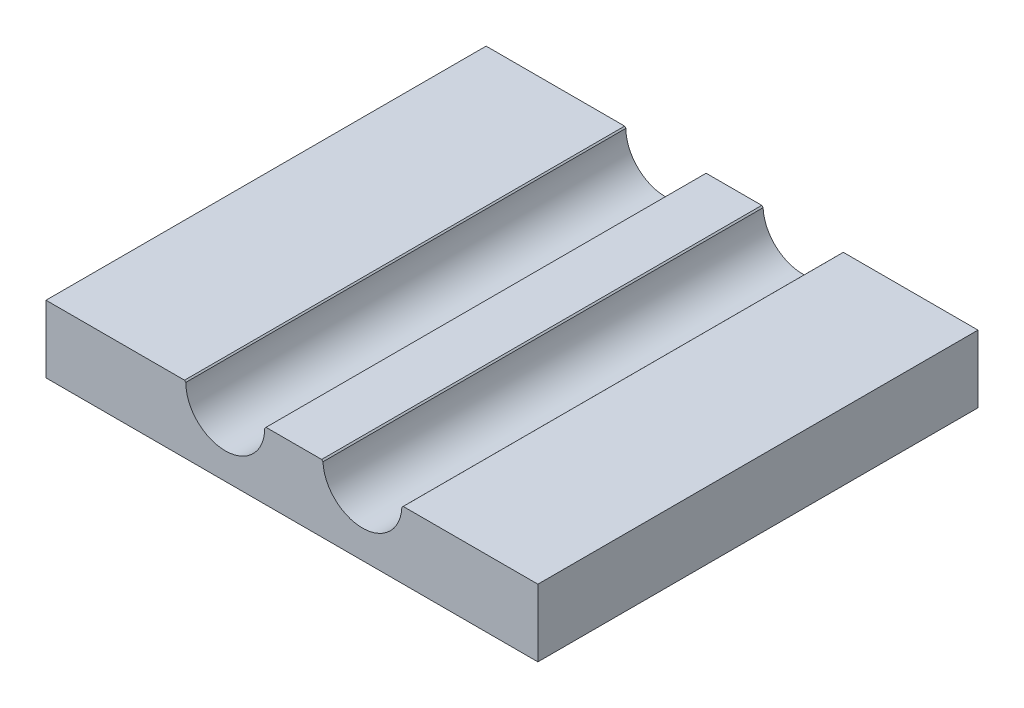
ISO-10303-21;
HEADER;
FILE_DESCRIPTION(('STEP AP214'),'2;1');
FILE_NAME('part.step','',(''),(''),'','','');
FILE_SCHEMA(('AUTOMOTIVE_DESIGN { 1 0 10303 214 1 1 1 1 }'));
ENDSEC;
DATA;
#1=APPLICATION_CONTEXT('core data for automotive mechanical design processes');
#2=APPLICATION_PROTOCOL_DEFINITION('international standard','automotive_design',2000,#1);
#3=PRODUCT_CONTEXT('',#1,'mechanical');
#4=PRODUCT('Part','Part','',(#3));
#5=PRODUCT_RELATED_PRODUCT_CATEGORY('part','',(#4));
#6=PRODUCT_DEFINITION_FORMATION('','',#4);
#7=PRODUCT_DEFINITION_CONTEXT('part definition',#1,'design');
#8=PRODUCT_DEFINITION('design','',#6,#7);
#9=PRODUCT_DEFINITION_SHAPE('','',#8);
#10=(LENGTH_UNIT() NAMED_UNIT(*) SI_UNIT(.MILLI.,.METRE.));
#11=(NAMED_UNIT(*) PLANE_ANGLE_UNIT() SI_UNIT($,.RADIAN.));
#12=(NAMED_UNIT(*) SI_UNIT($,.STERADIAN.) SOLID_ANGLE_UNIT());
#13=UNCERTAINTY_MEASURE_WITH_UNIT(LENGTH_MEASURE(1.E-05),#10,'distance_accuracy_value','');
#14=(GEOMETRIC_REPRESENTATION_CONTEXT(3) GLOBAL_UNCERTAINTY_ASSIGNED_CONTEXT((#13)) GLOBAL_UNIT_ASSIGNED_CONTEXT((#10,
#11,#12)) REPRESENTATION_CONTEXT('',''));
#15=CARTESIAN_POINT('',(0.,0.,0.));
#16=DIRECTION('',(0.,0.,1.));
#17=DIRECTION('',(1.,0.,0.));
#18=AXIS2_PLACEMENT_3D('',#15,#16,#17);
#19=CARTESIAN_POINT('',(-19.,2.,-17.));
#20=DIRECTION('',(1.,0.,0.));
#21=DIRECTION('',(0.,0.,-1.));
#22=AXIS2_PLACEMENT_3D('',#19,#20,#21);
#23=PLANE('',#22);
#24=DIRECTION('',(0.,0.,1.));
#25=VECTOR('',#24,1.);
#26=CARTESIAN_POINT('',(-19.,0.,-17.));
#27=LINE('',#26,#25);
#28=CARTESIAN_POINT('',(-19.,0.,-17.));
#29=VERTEX_POINT('',#28);
#30=CARTESIAN_POINT('',(-19.,0.,17.));
#31=VERTEX_POINT('',#30);
#32=EDGE_CURVE('E152',#29,#31,#27,.T.);
#33=ORIENTED_EDGE('',*,*,#32,.T.);
#34=DIRECTION('',(0.,-1.,0.));
#35=VECTOR('',#34,1.);
#36=CARTESIAN_POINT('',(-19.,2.,17.));
#37=LINE('',#36,#35);
#38=CARTESIAN_POINT('',(-19.,5.19853740308985,17.));
#39=VERTEX_POINT('',#38);
#40=EDGE_CURVE('E148',#39,#31,#37,.T.);
#41=ORIENTED_EDGE('',*,*,#40,.F.);
#42=DIRECTION('',(0.,0.,1.));
#43=VECTOR('',#42,1.);
#44=CARTESIAN_POINT('',(-19.,5.19853740308985,-17.));
#45=LINE('',#44,#43);
#46=CARTESIAN_POINT('',(-19.,5.19853740308985,-17.));
#47=VERTEX_POINT('',#46);
#48=EDGE_CURVE('E129',#47,#39,#45,.T.);
#49=ORIENTED_EDGE('',*,*,#48,.F.);
#50=DIRECTION('',(0.,-1.,0.));
#51=VECTOR('',#50,1.);
#52=CARTESIAN_POINT('',(-19.,2.,-17.));
#53=LINE('',#52,#51);
#54=EDGE_CURVE('E137',#47,#29,#53,.T.);
#55=ORIENTED_EDGE('',*,*,#54,.T.);
#56=EDGE_LOOP('',(#33,#41,#49,#55));
#57=FACE_BOUND('',#56,.T.);
#58=ADVANCED_FACE('F34',(#57),#23,.F.);
#59=CARTESIAN_POINT('',(-19.,2.,17.));
#60=DIRECTION('',(0.,0.,-1.));
#61=DIRECTION('',(-1.,0.,0.));
#62=AXIS2_PLACEMENT_3D('',#59,#60,#61);
#63=PLANE('',#62);
#64=DIRECTION('',(-1.,0.,0.));
#65=VECTOR('',#64,1.);
#66=CARTESIAN_POINT('',(19.,5.19950437404045,17.));
#67=LINE('',#66,#65);
#68=CARTESIAN_POINT('',(19.,5.19950437404045,17.));
#69=VERTEX_POINT('',#68);
#70=CARTESIAN_POINT('',(8.59514601795926,5.19950437404045,17.));
#71=VERTEX_POINT('',#70);
#72=EDGE_CURVE('E214',#69,#71,#67,.T.);
#73=ORIENTED_EDGE('',*,*,#72,.T.);
#74=DIRECTION('',(0.713628649764798,0.700524196751883,0.));
#75=VECTOR('',#74,1.);
#76=CARTESIAN_POINT('',(8.59514601795926,5.19950437404045,17.));
#77=LINE('',#76,#75);
#78=CARTESIAN_POINT('',(8.49156819575268,5.09782856446289,17.));
#79=VERTEX_POINT('',#78);
#80=EDGE_CURVE('E179',#71,#79,#77,.F.);
#81=ORIENTED_EDGE('',*,*,#80,.T.);
#82=CARTESIAN_POINT('',(5.44433729683627,5.22776642918728,17.));
#83=DIRECTION('',(0.,0.,-1.));
#84=DIRECTION('',(1.,0.,0.));
#85=AXIS2_PLACEMENT_3D('',#82,#83,#84);
#86=CIRCLE('',#85,3.05);
#87=CARTESIAN_POINT('',(2.39747173200565,5.08952667423475,17.));
#88=VERTEX_POINT('',#87);
#89=EDGE_CURVE('E216',#79,#88,#86,.T.);
#90=ORIENTED_EDGE('',*,*,#89,.T.);
#91=DIRECTION('',(0.70710678118654,-0.707106781186555,0.));
#92=VECTOR('',#91,1.);
#93=CARTESIAN_POINT('',(2.39747173200564,5.08952667423475,17.));
#94=LINE('',#93,#92);
#95=CARTESIAN_POINT('',(2.29454169320224,5.19245671303816,17.));
#96=VERTEX_POINT('',#95);
#97=EDGE_CURVE('E173',#88,#96,#94,.F.);
#98=ORIENTED_EDGE('',*,*,#97,.T.);
#99=DIRECTION('',(-1.,0.,0.));
#100=VECTOR('',#99,1.);
#101=CARTESIAN_POINT('',(-2.10116958482422,5.19245671303816,17.));
#102=LINE('',#101,#100);
#103=CARTESIAN_POINT('',(-2.00417351717299,5.19245671303816,17.));
#104=VERTEX_POINT('',#103);
#105=EDGE_CURVE('E212',#96,#104,#102,.T.);
#106=ORIENTED_EDGE('',*,*,#105,.T.);
#107=DIRECTION('',(0.684507714180994,0.729005616731936,0.));
#108=VECTOR('',#107,1.);
#109=CARTESIAN_POINT('',(-2.00417351717299,5.19245671303816,17.));
#110=LINE('',#109,#108);
#111=CARTESIAN_POINT('',(-2.09966479765156,5.09075781560339,17.));
#112=VERTEX_POINT('',#111);
#113=EDGE_CURVE('E175',#104,#112,#110,.F.);
#114=ORIENTED_EDGE('',*,*,#113,.T.);
#115=CARTESIAN_POINT('',(-5.14965941266187,5.09648916867897,17.));
#116=DIRECTION('',(0.,0.,-1.));
#117=DIRECTION('',(1.,0.,0.));
#118=AXIS2_PLACEMENT_3D('',#115,#116,#117);
#119=CIRCLE('',#118,3.05);
#120=CARTESIAN_POINT('',(-8.19965710291714,5.1002427586348,17.));
#121=VERTEX_POINT('',#120);
#122=EDGE_CURVE('E204',#112,#121,#119,.T.);
#123=ORIENTED_EDGE('',*,*,#122,.T.);
#124=DIRECTION('',(0.707106781186544,-0.707106781186551,0.));
#125=VECTOR('',#124,1.);
#126=CARTESIAN_POINT('',(-8.19965710291714,5.1002427586348,17.));
#127=LINE('',#126,#125);
#128=CARTESIAN_POINT('',(-8.29795174737219,5.19853740308985,17.));
#129=VERTEX_POINT('',#128);
#130=EDGE_CURVE('E177',#121,#129,#127,.F.);
#131=ORIENTED_EDGE('',*,*,#130,.T.);
#132=DIRECTION('',(-1.,0.,0.));
#133=VECTOR('',#132,1.);
#134=CARTESIAN_POINT('',(-8.19795174737218,5.19853740308985,17.));
#135=LINE('',#134,#133);
#136=EDGE_CURVE('E211',#129,#39,#135,.T.);
#137=ORIENTED_EDGE('',*,*,#136,.T.);
#138=ORIENTED_EDGE('',*,*,#40,.T.);
#139=DIRECTION('',(1.,0.,0.));
#140=VECTOR('',#139,1.);
#141=CARTESIAN_POINT('',(-19.,0.,17.));
#142=LINE('',#141,#140);
#143=CARTESIAN_POINT('',(19.,0.,17.));
#144=VERTEX_POINT('',#143);
#145=EDGE_CURVE('E159',#31,#144,#142,.T.);
#146=ORIENTED_EDGE('',*,*,#145,.T.);
#147=DIRECTION('',(0.,-1.,0.));
#148=VECTOR('',#147,1.);
#149=CARTESIAN_POINT('',(19.,2.,17.));
#150=LINE('',#149,#148);
#151=EDGE_CURVE('E167',#69,#144,#150,.T.);
#152=ORIENTED_EDGE('',*,*,#151,.F.);
#153=EDGE_LOOP('',(#73,#81,#90,#98,#106,#114,#123,#131,#137,#138,#146,#152));
#154=FACE_BOUND('',#153,.T.);
#155=ADVANCED_FACE('F209',(#154),#63,.F.);
#156=CARTESIAN_POINT('',(19.,2.,-17.));
#157=DIRECTION('',(-1.,0.,0.));
#158=DIRECTION('',(0.,0.,1.));
#159=AXIS2_PLACEMENT_3D('',#156,#157,#158);
#160=PLANE('',#159);
#161=DIRECTION('',(0.,0.,-1.));
#162=VECTOR('',#161,1.);
#163=CARTESIAN_POINT('',(19.,0.,-17.));
#164=LINE('',#163,#162);
#165=CARTESIAN_POINT('',(19.,0.,-17.));
#166=VERTEX_POINT('',#165);
#167=EDGE_CURVE('E162',#144,#166,#164,.T.);
#168=ORIENTED_EDGE('',*,*,#167,.T.);
#169=DIRECTION('',(0.,-1.,0.));
#170=VECTOR('',#169,1.);
#171=CARTESIAN_POINT('',(19.,2.,-17.));
#172=LINE('',#171,#170);
#173=CARTESIAN_POINT('',(19.,5.19950437404045,-17.));
#174=VERTEX_POINT('',#173);
#175=EDGE_CURVE('E145',#174,#166,#172,.T.);
#176=ORIENTED_EDGE('',*,*,#175,.F.);
#177=DIRECTION('',(0.,0.,1.));
#178=VECTOR('',#177,1.);
#179=CARTESIAN_POINT('',(19.,5.19950437404045,-17.));
#180=LINE('',#179,#178);
#181=EDGE_CURVE('E149',#174,#69,#180,.T.);
#182=ORIENTED_EDGE('',*,*,#181,.T.);
#183=ORIENTED_EDGE('',*,*,#151,.T.);
#184=EDGE_LOOP('',(#168,#176,#182,#183));
#185=FACE_BOUND('',#184,.T.);
#186=ADVANCED_FACE('F241',(#185),#160,.F.);
#187=CARTESIAN_POINT('',(-19.,2.,-17.));
#188=DIRECTION('',(0.,0.,1.));
#189=DIRECTION('',(1.,0.,0.));
#190=AXIS2_PLACEMENT_3D('',#187,#188,#189);
#191=PLANE('',#190);
#192=CARTESIAN_POINT('',(5.44433729683627,5.22776642918728,-17.));
#193=DIRECTION('',(0.,0.,-1.));
#194=DIRECTION('',(1.,0.,0.));
#195=AXIS2_PLACEMENT_3D('',#192,#193,#194);
#196=CIRCLE('',#195,3.05);
#197=CARTESIAN_POINT('',(8.49156819575267,5.09782856446289,-17.));
#198=VERTEX_POINT('',#197);
#199=CARTESIAN_POINT('',(2.39747173200565,5.08952667423475,-17.));
#200=VERTEX_POINT('',#199);
#201=EDGE_CURVE('E219',#198,#200,#196,.T.);
#202=ORIENTED_EDGE('',*,*,#201,.F.);
#203=DIRECTION('',(-0.713628649764798,-0.700524196751883,0.));
#204=VECTOR('',#203,1.);
#205=CARTESIAN_POINT('',(8.59514601795926,5.19950437404045,-17.));
#206=LINE('',#205,#204);
#207=CARTESIAN_POINT('',(8.59514601795926,5.19950437404045,-17.));
#208=VERTEX_POINT('',#207);
#209=EDGE_CURVE('E191',#198,#208,#206,.F.);
#210=ORIENTED_EDGE('',*,*,#209,.T.);
#211=DIRECTION('',(-1.,0.,0.));
#212=VECTOR('',#211,1.);
#213=CARTESIAN_POINT('',(19.,5.19950437404045,-17.));
#214=LINE('',#213,#212);
#215=EDGE_CURVE('E133',#174,#208,#214,.T.);
#216=ORIENTED_EDGE('',*,*,#215,.F.);
#217=ORIENTED_EDGE('',*,*,#175,.T.);
#218=DIRECTION('',(-1.,0.,0.));
#219=VECTOR('',#218,1.);
#220=CARTESIAN_POINT('',(-19.,0.,-17.));
#221=LINE('',#220,#219);
#222=EDGE_CURVE('E141',#166,#29,#221,.T.);
#223=ORIENTED_EDGE('',*,*,#222,.T.);
#224=ORIENTED_EDGE('',*,*,#54,.F.);
#225=DIRECTION('',(-1.,0.,0.));
#226=VECTOR('',#225,1.);
#227=CARTESIAN_POINT('',(-8.19795174737218,5.19853740308985,-17.));
#228=LINE('',#227,#226);
#229=CARTESIAN_POINT('',(-8.29795174737219,5.19853740308985,-17.));
#230=VERTEX_POINT('',#229);
#231=EDGE_CURVE('E124',#230,#47,#228,.T.);
#232=ORIENTED_EDGE('',*,*,#231,.F.);
#233=DIRECTION('',(-0.707106781186544,0.707106781186551,0.));
#234=VECTOR('',#233,1.);
#235=CARTESIAN_POINT('',(-8.19965710291714,5.1002427586348,-17.));
#236=LINE('',#235,#234);
#237=CARTESIAN_POINT('',(-8.19965710291714,5.1002427586348,-17.));
#238=VERTEX_POINT('',#237);
#239=EDGE_CURVE('E189',#230,#238,#236,.F.);
#240=ORIENTED_EDGE('',*,*,#239,.T.);
#241=CARTESIAN_POINT('',(-5.14965941266187,5.09648916867897,-17.));
#242=DIRECTION('',(0.,0.,-1.));
#243=DIRECTION('',(1.,0.,0.));
#244=AXIS2_PLACEMENT_3D('',#241,#242,#243);
#245=CIRCLE('',#244,3.05);
#246=CARTESIAN_POINT('',(-2.09966479765156,5.09075781560339,-17.));
#247=VERTEX_POINT('',#246);
#248=EDGE_CURVE('E134',#247,#238,#245,.T.);
#249=ORIENTED_EDGE('',*,*,#248,.F.);
#250=DIRECTION('',(-0.684507714180994,-0.729005616731936,0.));
#251=VECTOR('',#250,1.);
#252=CARTESIAN_POINT('',(-2.00417351717299,5.19245671303816,-17.));
#253=LINE('',#252,#251);
#254=CARTESIAN_POINT('',(-2.00417351717299,5.19245671303816,-17.));
#255=VERTEX_POINT('',#254);
#256=EDGE_CURVE('E49',#247,#255,#253,.F.);
#257=ORIENTED_EDGE('',*,*,#256,.T.);
#258=DIRECTION('',(-1.,0.,0.));
#259=VECTOR('',#258,1.);
#260=CARTESIAN_POINT('',(-2.10116958482422,5.19245671303816,-17.));
#261=LINE('',#260,#259);
#262=CARTESIAN_POINT('',(2.29454169320224,5.19245671303816,-17.));
#263=VERTEX_POINT('',#262);
#264=EDGE_CURVE('E222',#263,#255,#261,.T.);
#265=ORIENTED_EDGE('',*,*,#264,.F.);
#266=DIRECTION('',(-0.70710678118654,0.707106781186555,0.));
#267=VECTOR('',#266,1.);
#268=CARTESIAN_POINT('',(2.39747173200564,5.08952667423475,-17.));
#269=LINE('',#268,#267);
#270=EDGE_CURVE('E186',#263,#200,#269,.F.);
#271=ORIENTED_EDGE('',*,*,#270,.T.);
#272=EDGE_LOOP('',(#202,#210,#216,#217,#223,#224,#232,#240,#249,#257,#265,#271));
#273=FACE_BOUND('',#272,.T.);
#274=ADVANCED_FACE('F139',(#273),#191,.F.);
#275=CARTESIAN_POINT('',(0.,0.,0.));
#276=DIRECTION('',(0.,1.,0.));
#277=DIRECTION('',(0.,0.,1.));
#278=AXIS2_PLACEMENT_3D('',#275,#276,#277);
#279=PLANE('',#278);
#280=ORIENTED_EDGE('',*,*,#32,.F.);
#281=ORIENTED_EDGE('',*,*,#222,.F.);
#282=ORIENTED_EDGE('',*,*,#167,.F.);
#283=ORIENTED_EDGE('',*,*,#145,.F.);
#284=EDGE_LOOP('',(#280,#281,#282,#283));
#285=FACE_BOUND('',#284,.T.);
#286=ADVANCED_FACE('F245',(#285),#279,.F.);
#287=CARTESIAN_POINT('',(5.44433729683627,5.22776642918728,-17.));
#288=DIRECTION('',(0.,0.,1.));
#289=DIRECTION('',(1.,0.,0.));
#290=AXIS2_PLACEMENT_3D('',#287,#288,#289);
#291=CYLINDRICAL_SURFACE('',#290,3.05);
#292=ORIENTED_EDGE('',*,*,#89,.F.);
#293=DIRECTION('',(0.,0.,1.));
#294=VECTOR('',#293,1.);
#295=CARTESIAN_POINT('',(8.49156819575268,5.09782856446289,-17.));
#296=LINE('',#295,#294);
#297=EDGE_CURVE('E184',#79,#198,#296,.F.);
#298=ORIENTED_EDGE('',*,*,#297,.T.);
#299=ORIENTED_EDGE('',*,*,#201,.T.);
#300=DIRECTION('',(0.,0.,1.));
#301=VECTOR('',#300,1.);
#302=CARTESIAN_POINT('',(2.39747173200565,5.08952667423475,-17.));
#303=LINE('',#302,#301);
#304=EDGE_CURVE('E181',#200,#88,#303,.T.);
#305=ORIENTED_EDGE('',*,*,#304,.T.);
#306=EDGE_LOOP('',(#292,#298,#299,#305));
#307=FACE_BOUND('',#306,.T.);
#308=ADVANCED_FACE('F231',(#307),#291,.F.);
#309=CARTESIAN_POINT('',(19.,5.19950437404045,-17.));
#310=DIRECTION('',(0.,1.,0.));
#311=DIRECTION('',(0.,0.,1.));
#312=AXIS2_PLACEMENT_3D('',#309,#310,#311);
#313=PLANE('',#312);
#314=ORIENTED_EDGE('',*,*,#215,.T.);
#315=DIRECTION('',(0.,0.,1.));
#316=VECTOR('',#315,1.);
#317=CARTESIAN_POINT('',(8.59514601795926,5.19950437404045,-17.));
#318=LINE('',#317,#316);
#319=EDGE_CURVE('E170',#208,#71,#318,.T.);
#320=ORIENTED_EDGE('',*,*,#319,.T.);
#321=ORIENTED_EDGE('',*,*,#72,.F.);
#322=ORIENTED_EDGE('',*,*,#181,.F.);
#323=EDGE_LOOP('',(#314,#320,#321,#322));
#324=FACE_BOUND('',#323,.T.);
#325=ADVANCED_FACE('F239',(#324),#313,.T.);
#326=CARTESIAN_POINT('',(-8.19795174737218,5.19853740308985,-17.));
#327=DIRECTION('',(0.,1.,0.));
#328=DIRECTION('',(0.,0.,1.));
#329=AXIS2_PLACEMENT_3D('',#326,#327,#328);
#330=PLANE('',#329);
#331=ORIENTED_EDGE('',*,*,#136,.F.);
#332=DIRECTION('',(0.,0.,-1.));
#333=VECTOR('',#332,1.);
#334=CARTESIAN_POINT('',(-8.29795174737219,5.19853740308985,-17.));
#335=LINE('',#334,#333);
#336=EDGE_CURVE('E131',#129,#230,#335,.T.);
#337=ORIENTED_EDGE('',*,*,#336,.T.);
#338=ORIENTED_EDGE('',*,*,#231,.T.);
#339=ORIENTED_EDGE('',*,*,#48,.T.);
#340=EDGE_LOOP('',(#331,#337,#338,#339));
#341=FACE_BOUND('',#340,.T.);
#342=ADVANCED_FACE('F127',(#341),#330,.T.);
#343=CARTESIAN_POINT('',(-5.14965941266187,5.09648916867897,-17.));
#344=DIRECTION('',(0.,0.,1.));
#345=DIRECTION('',(1.,0.,0.));
#346=AXIS2_PLACEMENT_3D('',#343,#344,#345);
#347=CYLINDRICAL_SURFACE('',#346,3.05);
#348=ORIENTED_EDGE('',*,*,#248,.T.);
#349=DIRECTION('',(0.,0.,1.));
#350=VECTOR('',#349,1.);
#351=CARTESIAN_POINT('',(-8.19965710291714,5.1002427586348,-17.));
#352=LINE('',#351,#350);
#353=EDGE_CURVE('E195',#238,#121,#352,.T.);
#354=ORIENTED_EDGE('',*,*,#353,.T.);
#355=ORIENTED_EDGE('',*,*,#122,.F.);
#356=DIRECTION('',(0.,0.,1.));
#357=VECTOR('',#356,1.);
#358=CARTESIAN_POINT('',(-2.09966479765156,5.09075781560339,-17.));
#359=LINE('',#358,#357);
#360=EDGE_CURVE('E193',#112,#247,#359,.F.);
#361=ORIENTED_EDGE('',*,*,#360,.T.);
#362=EDGE_LOOP('',(#348,#354,#355,#361));
#363=FACE_BOUND('',#362,.T.);
#364=ADVANCED_FACE('F203',(#363),#347,.F.);
#365=CARTESIAN_POINT('',(-2.10116958482422,5.19245671303816,-17.));
#366=DIRECTION('',(0.,1.,0.));
#367=DIRECTION('',(0.,0.,1.));
#368=AXIS2_PLACEMENT_3D('',#365,#366,#367);
#369=PLANE('',#368);
#370=ORIENTED_EDGE('',*,*,#264,.T.);
#371=DIRECTION('',(0.,0.,1.));
#372=VECTOR('',#371,1.);
#373=CARTESIAN_POINT('',(-2.00417351717299,5.19245671303816,-17.));
#374=LINE('',#373,#372);
#375=EDGE_CURVE('E11',#255,#104,#374,.T.);
#376=ORIENTED_EDGE('',*,*,#375,.T.);
#377=ORIENTED_EDGE('',*,*,#105,.F.);
#378=DIRECTION('',(0.,0.,-1.));
#379=VECTOR('',#378,1.);
#380=CARTESIAN_POINT('',(2.29454169320224,5.19245671303816,-17.));
#381=LINE('',#380,#379);
#382=EDGE_CURVE('E42',#96,#263,#381,.T.);
#383=ORIENTED_EDGE('',*,*,#382,.T.);
#384=EDGE_LOOP('',(#370,#376,#377,#383));
#385=FACE_BOUND('',#384,.T.);
#386=ADVANCED_FACE('F250',(#385),#369,.T.);
#387=CARTESIAN_POINT('',(8.59514601795926,5.19950437404045,-17.));
#388=DIRECTION('',(0.700524196751883,-0.713628649764798,0.));
#389=DIRECTION('',(0.,0.,1.));
#390=AXIS2_PLACEMENT_3D('',#387,#388,#389);
#391=PLANE('',#390);
#392=ORIENTED_EDGE('',*,*,#209,.F.);
#393=ORIENTED_EDGE('',*,*,#297,.F.);
#394=ORIENTED_EDGE('',*,*,#80,.F.);
#395=ORIENTED_EDGE('',*,*,#319,.F.);
#396=EDGE_LOOP('',(#392,#393,#394,#395));
#397=FACE_BOUND('',#396,.T.);
#398=ADVANCED_FACE('F234',(#397),#391,.F.);
#399=CARTESIAN_POINT('',(-8.19965710291714,5.1002427586348,-17.));
#400=DIRECTION('',(-0.707106781186551,-0.707106781186544,0.));
#401=DIRECTION('',(0.,0.,1.));
#402=AXIS2_PLACEMENT_3D('',#399,#400,#401);
#403=PLANE('',#402);
#404=ORIENTED_EDGE('',*,*,#239,.F.);
#405=ORIENTED_EDGE('',*,*,#336,.F.);
#406=ORIENTED_EDGE('',*,*,#130,.F.);
#407=ORIENTED_EDGE('',*,*,#353,.F.);
#408=EDGE_LOOP('',(#404,#405,#406,#407));
#409=FACE_BOUND('',#408,.T.);
#410=ADVANCED_FACE('F246',(#409),#403,.F.);
#411=CARTESIAN_POINT('',(-2.00417351717299,5.19245671303816,-17.));
#412=DIRECTION('',(0.729005616731936,-0.684507714180994,0.));
#413=DIRECTION('',(0.,0.,1.));
#414=AXIS2_PLACEMENT_3D('',#411,#412,#413);
#415=PLANE('',#414);
#416=ORIENTED_EDGE('',*,*,#256,.F.);
#417=ORIENTED_EDGE('',*,*,#360,.F.);
#418=ORIENTED_EDGE('',*,*,#113,.F.);
#419=ORIENTED_EDGE('',*,*,#375,.F.);
#420=EDGE_LOOP('',(#416,#417,#418,#419));
#421=FACE_BOUND('',#420,.T.);
#422=ADVANCED_FACE('F249',(#421),#415,.F.);
#423=CARTESIAN_POINT('',(2.39747173200564,5.08952667423475,-17.));
#424=DIRECTION('',(-0.707106781186555,-0.70710678118654,0.));
#425=DIRECTION('',(0.,0.,1.));
#426=AXIS2_PLACEMENT_3D('',#423,#424,#425);
#427=PLANE('',#426);
#428=ORIENTED_EDGE('',*,*,#270,.F.);
#429=ORIENTED_EDGE('',*,*,#382,.F.);
#430=ORIENTED_EDGE('',*,*,#97,.F.);
#431=ORIENTED_EDGE('',*,*,#304,.F.);
#432=EDGE_LOOP('',(#428,#429,#430,#431));
#433=FACE_BOUND('',#432,.T.);
#434=ADVANCED_FACE('F36',(#433),#427,.F.);
#435=CLOSED_SHELL('',(#58,#155,#186,#274,#286,#308,#325,#342,#364,#386,#398,#410,#422,#434));
#436=MANIFOLD_SOLID_BREP('B2',#435);
#437=ADVANCED_BREP_SHAPE_REPRESENTATION('',(#18,#436),#14);
#438=SHAPE_DEFINITION_REPRESENTATION(#9,#437);
ENDSEC;
END-ISO-10303-21;
